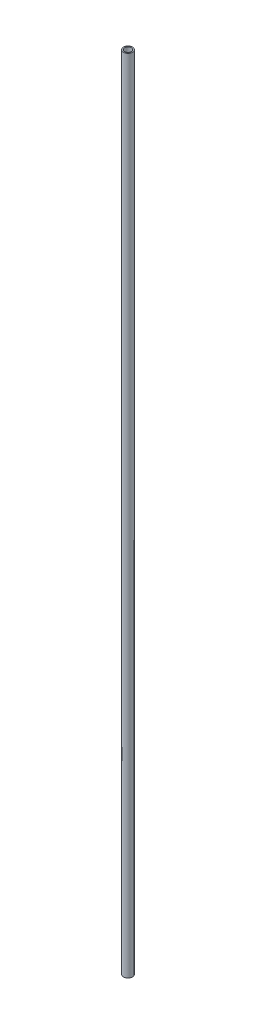
ISO-10303-21;
HEADER;
FILE_DESCRIPTION(('STEP AP214'),'2;1');
FILE_NAME('part.step','',(''),(''),'','','');
FILE_SCHEMA(('AUTOMOTIVE_DESIGN { 1 0 10303 214 1 1 1 1 }'));
ENDSEC;
DATA;
#1=APPLICATION_CONTEXT('core data for automotive mechanical design processes');
#2=APPLICATION_PROTOCOL_DEFINITION('international standard','automotive_design',2000,#1);
#3=PRODUCT_CONTEXT('',#1,'mechanical');
#4=PRODUCT('Part','Part','',(#3));
#5=PRODUCT_RELATED_PRODUCT_CATEGORY('part','',(#4));
#6=PRODUCT_DEFINITION_FORMATION('','',#4);
#7=PRODUCT_DEFINITION_CONTEXT('part definition',#1,'design');
#8=PRODUCT_DEFINITION('design','',#6,#7);
#9=PRODUCT_DEFINITION_SHAPE('','',#8);
#10=(LENGTH_UNIT() NAMED_UNIT(*) SI_UNIT(.MILLI.,.METRE.));
#11=(NAMED_UNIT(*) PLANE_ANGLE_UNIT() SI_UNIT($,.RADIAN.));
#12=(NAMED_UNIT(*) SI_UNIT($,.STERADIAN.) SOLID_ANGLE_UNIT());
#13=UNCERTAINTY_MEASURE_WITH_UNIT(LENGTH_MEASURE(1.E-05),#10,'distance_accuracy_value','');
#14=(GEOMETRIC_REPRESENTATION_CONTEXT(3) GLOBAL_UNCERTAINTY_ASSIGNED_CONTEXT((#13)) GLOBAL_UNIT_ASSIGNED_CONTEXT((#10,
#11,#12)) REPRESENTATION_CONTEXT('',''));
#15=CARTESIAN_POINT('',(0.,0.,0.));
#16=DIRECTION('',(0.,0.,1.));
#17=DIRECTION('',(1.,0.,0.));
#18=AXIS2_PLACEMENT_3D('',#15,#16,#17);
#19=CARTESIAN_POINT('',(0.,-355.,0.));
#20=DIRECTION('',(0.,1.,0.));
#21=DIRECTION('',(0.,0.,1.));
#22=AXIS2_PLACEMENT_3D('',#19,#20,#21);
#23=CYLINDRICAL_SURFACE('',#22,4.);
#24=CARTESIAN_POINT('',(0.,-355.,0.));
#25=DIRECTION('',(0.,1.,0.));
#26=DIRECTION('',(0.,0.,1.));
#27=AXIS2_PLACEMENT_3D('',#24,#25,#26);
#28=CIRCLE('',#27,4.);
#29=CARTESIAN_POINT('',(0.,-355.,4.));
#30=VERTEX_POINT('',#29);
#31=EDGE_CURVE('E10',#30,#30,#28,.T.);
#32=ORIENTED_EDGE('',*,*,#31,.T.);
#33=EDGE_LOOP('',(#32));
#34=FACE_BOUND('',#33,.T.);
#35=CARTESIAN_POINT('',(0.,355.,0.));
#36=DIRECTION('',(0.,1.,0.));
#37=DIRECTION('',(0.,0.,1.));
#38=AXIS2_PLACEMENT_3D('',#35,#36,#37);
#39=CIRCLE('',#38,4.);
#40=CARTESIAN_POINT('',(0.,355.,4.));
#41=VERTEX_POINT('',#40);
#42=EDGE_CURVE('E40',#41,#41,#39,.T.);
#43=ORIENTED_EDGE('',*,*,#42,.F.);
#44=EDGE_LOOP('',(#43));
#45=FACE_BOUND('',#44,.T.);
#46=ADVANCED_FACE('F37',(#34,#45),#23,.T.);
#47=CARTESIAN_POINT('',(0.,-355.,0.));
#48=DIRECTION('',(0.,1.,0.));
#49=DIRECTION('',(0.,0.,1.));
#50=AXIS2_PLACEMENT_3D('',#47,#48,#49);
#51=PLANE('',#50);
#52=CARTESIAN_POINT('',(0.,-355.,0.));
#53=DIRECTION('',(0.,1.,0.));
#54=DIRECTION('',(0.,0.,1.));
#55=AXIS2_PLACEMENT_3D('',#52,#53,#54);
#56=CIRCLE('',#55,3.);
#57=CARTESIAN_POINT('',(0.,-355.,3.));
#58=VERTEX_POINT('',#57);
#59=EDGE_CURVE('E49',#58,#58,#56,.T.);
#60=ORIENTED_EDGE('',*,*,#59,.T.);
#61=EDGE_LOOP('',(#60));
#62=FACE_BOUND('',#61,.T.);
#63=ORIENTED_EDGE('',*,*,#31,.F.);
#64=EDGE_LOOP('',(#63));
#65=FACE_BOUND('',#64,.T.);
#66=ADVANCED_FACE('F59',(#62,#65),#51,.F.);
#67=CARTESIAN_POINT('',(0.,355.,0.));
#68=DIRECTION('',(0.,1.,0.));
#69=DIRECTION('',(0.,0.,1.));
#70=AXIS2_PLACEMENT_3D('',#67,#68,#69);
#71=PLANE('',#70);
#72=CARTESIAN_POINT('',(0.,355.,0.));
#73=DIRECTION('',(0.,1.,0.));
#74=DIRECTION('',(0.,0.,1.));
#75=AXIS2_PLACEMENT_3D('',#72,#73,#74);
#76=CIRCLE('',#75,3.);
#77=CARTESIAN_POINT('',(0.,355.,3.));
#78=VERTEX_POINT('',#77);
#79=EDGE_CURVE('E51',#78,#78,#76,.T.);
#80=ORIENTED_EDGE('',*,*,#79,.F.);
#81=EDGE_LOOP('',(#80));
#82=FACE_BOUND('',#81,.T.);
#83=ORIENTED_EDGE('',*,*,#42,.T.);
#84=EDGE_LOOP('',(#83));
#85=FACE_BOUND('',#84,.T.);
#86=ADVANCED_FACE('F65',(#82,#85),#71,.T.);
#87=CARTESIAN_POINT('',(0.,-355.,0.));
#88=DIRECTION('',(0.,1.,0.));
#89=DIRECTION('',(0.,0.,1.));
#90=AXIS2_PLACEMENT_3D('',#87,#88,#89);
#91=CYLINDRICAL_SURFACE('',#90,3.);
#92=ORIENTED_EDGE('',*,*,#59,.F.);
#93=EDGE_LOOP('',(#92));
#94=FACE_BOUND('',#93,.T.);
#95=ORIENTED_EDGE('',*,*,#79,.T.);
#96=EDGE_LOOP('',(#95));
#97=FACE_BOUND('',#96,.T.);
#98=ADVANCED_FACE('F62',(#94,#97),#91,.F.);
#99=CLOSED_SHELL('',(#46,#66,#86,#98));
#100=MANIFOLD_SOLID_BREP('B2',#99);
#101=ADVANCED_BREP_SHAPE_REPRESENTATION('',(#18,#100),#14);
#102=SHAPE_DEFINITION_REPRESENTATION(#9,#101);
ENDSEC;
END-ISO-10303-21;
